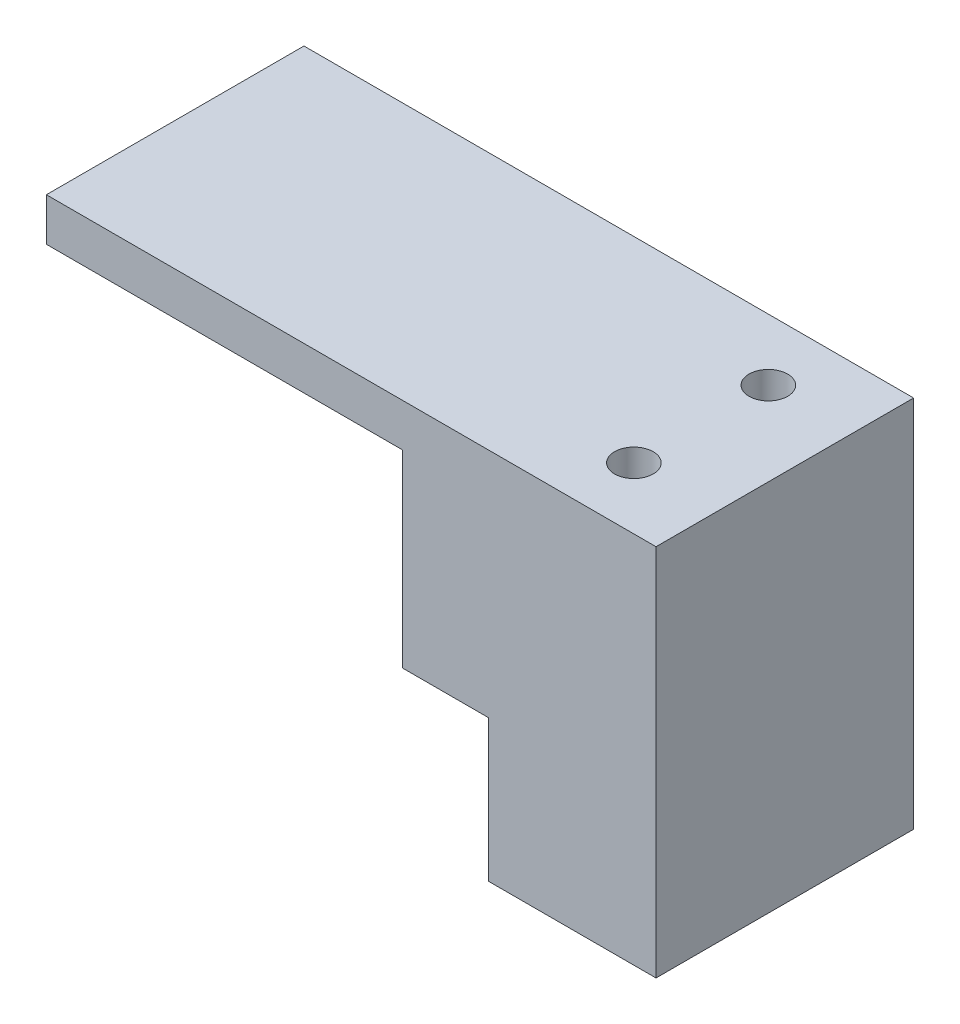
ISO-10303-21;
HEADER;
FILE_DESCRIPTION(('STEP AP214'),'2;1');
FILE_NAME('part.step','',(''),(''),'','','');
FILE_SCHEMA(('AUTOMOTIVE_DESIGN { 1 0 10303 214 1 1 1 1 }'));
ENDSEC;
DATA;
#1=APPLICATION_CONTEXT('core data for automotive mechanical design processes');
#2=APPLICATION_PROTOCOL_DEFINITION('international standard','automotive_design',2000,#1);
#3=PRODUCT_CONTEXT('',#1,'mechanical');
#4=PRODUCT('Part','Part','',(#3));
#5=PRODUCT_RELATED_PRODUCT_CATEGORY('part','',(#4));
#6=PRODUCT_DEFINITION_FORMATION('','',#4);
#7=PRODUCT_DEFINITION_CONTEXT('part definition',#1,'design');
#8=PRODUCT_DEFINITION('design','',#6,#7);
#9=PRODUCT_DEFINITION_SHAPE('','',#8);
#10=(LENGTH_UNIT() NAMED_UNIT(*) SI_UNIT(.MILLI.,.METRE.));
#11=(NAMED_UNIT(*) PLANE_ANGLE_UNIT() SI_UNIT($,.RADIAN.));
#12=(NAMED_UNIT(*) SI_UNIT($,.STERADIAN.) SOLID_ANGLE_UNIT());
#13=UNCERTAINTY_MEASURE_WITH_UNIT(LENGTH_MEASURE(1.E-05),#10,'distance_accuracy_value','');
#14=(GEOMETRIC_REPRESENTATION_CONTEXT(3) GLOBAL_UNCERTAINTY_ASSIGNED_CONTEXT((#13)) GLOBAL_UNIT_ASSIGNED_CONTEXT((#10,
#11,#12)) REPRESENTATION_CONTEXT('',''));
#15=CARTESIAN_POINT('',(0.,0.,0.));
#16=DIRECTION('',(0.,0.,1.));
#17=DIRECTION('',(1.,0.,0.));
#18=AXIS2_PLACEMENT_3D('',#15,#16,#17);
#19=CARTESIAN_POINT('',(0.,0.,0.));
#20=DIRECTION('',(0.,-1.,0.));
#21=DIRECTION('',(0.,0.,-1.));
#22=AXIS2_PLACEMENT_3D('',#19,#20,#21);
#23=PLANE('',#22);
#24=CARTESIAN_POINT('',(9.75,0.,-22.8300926632119));
#25=DIRECTION('',(0.,1.,0.));
#26=DIRECTION('',(0.,0.,1.));
#27=AXIS2_PLACEMENT_3D('',#24,#25,#26);
#28=CIRCLE('',#27,2.25);
#29=CARTESIAN_POINT('',(9.75,0.,-20.5800926632119));
#30=VERTEX_POINT('',#29);
#31=EDGE_CURVE('E127',#30,#30,#28,.T.);
#32=ORIENTED_EDGE('',*,*,#31,.T.);
#33=EDGE_LOOP('',(#32));
#34=FACE_BOUND('',#33,.T.);
#35=DIRECTION('',(0.,0.,1.));
#36=VECTOR('',#35,1.);
#37=CARTESIAN_POINT('',(0.,0.,0.));
#38=LINE('',#37,#36);
#39=CARTESIAN_POINT('',(0.,0.,-30.));
#40=VERTEX_POINT('',#39);
#41=CARTESIAN_POINT('',(0.,0.,0.));
#42=VERTEX_POINT('',#41);
#43=EDGE_CURVE('E87',#40,#42,#38,.T.);
#44=ORIENTED_EDGE('',*,*,#43,.F.);
#45=DIRECTION('',(-1.,0.,0.));
#46=VECTOR('',#45,1.);
#47=CARTESIAN_POINT('',(0.,0.,-30.));
#48=LINE('',#47,#46);
#49=CARTESIAN_POINT('',(19.5,0.,-30.));
#50=VERTEX_POINT('',#49);
#51=EDGE_CURVE('E75',#50,#40,#48,.T.);
#52=ORIENTED_EDGE('',*,*,#51,.F.);
#53=DIRECTION('',(0.,0.,-1.));
#54=VECTOR('',#53,1.);
#55=CARTESIAN_POINT('',(19.5,0.,0.));
#56=LINE('',#55,#54);
#57=CARTESIAN_POINT('',(19.5,0.,0.));
#58=VERTEX_POINT('',#57);
#59=EDGE_CURVE('E65',#58,#50,#56,.T.);
#60=ORIENTED_EDGE('',*,*,#59,.F.);
#61=DIRECTION('',(1.,0.,0.));
#62=VECTOR('',#61,1.);
#63=CARTESIAN_POINT('',(0.,0.,0.));
#64=LINE('',#63,#62);
#65=EDGE_CURVE('E76',#42,#58,#64,.T.);
#66=ORIENTED_EDGE('',*,*,#65,.F.);
#67=EDGE_LOOP('',(#44,#52,#60,#66));
#68=FACE_BOUND('',#67,.T.);
#69=CARTESIAN_POINT('',(9.75,0.,-7.16990733678813));
#70=DIRECTION('',(0.,1.,0.));
#71=DIRECTION('',(0.,0.,1.));
#72=AXIS2_PLACEMENT_3D('',#69,#70,#71);
#73=CIRCLE('',#72,2.25);
#74=CARTESIAN_POINT('',(9.75,0.,-4.91990733678813));
#75=VERTEX_POINT('',#74);
#76=EDGE_CURVE('E124',#75,#75,#73,.T.);
#77=ORIENTED_EDGE('',*,*,#76,.T.);
#78=EDGE_LOOP('',(#77));
#79=FACE_BOUND('',#78,.T.);
#80=ADVANCED_FACE('F32',(#34,#68,#79),#23,.T.);
#81=CARTESIAN_POINT('',(0.,16.5,0.));
#82=DIRECTION('',(1.,0.,0.));
#83=DIRECTION('',(0.,0.,-1.));
#84=AXIS2_PLACEMENT_3D('',#81,#82,#83);
#85=PLANE('',#84);
#86=ORIENTED_EDGE('',*,*,#43,.T.);
#87=DIRECTION('',(0.,-1.,0.));
#88=VECTOR('',#87,1.);
#89=CARTESIAN_POINT('',(0.,16.5,0.));
#90=LINE('',#89,#88);
#91=CARTESIAN_POINT('',(0.,16.5,0.));
#92=VERTEX_POINT('',#91);
#93=EDGE_CURVE('E11',#92,#42,#90,.T.);
#94=ORIENTED_EDGE('',*,*,#93,.F.);
#95=DIRECTION('',(0.,0.,1.));
#96=VECTOR('',#95,1.);
#97=CARTESIAN_POINT('',(0.,16.5,0.));
#98=LINE('',#97,#96);
#99=CARTESIAN_POINT('',(0.,16.5,-30.));
#100=VERTEX_POINT('',#99);
#101=EDGE_CURVE('E88',#100,#92,#98,.T.);
#102=ORIENTED_EDGE('',*,*,#101,.F.);
#103=DIRECTION('',(0.,-1.,0.));
#104=VECTOR('',#103,1.);
#105=CARTESIAN_POINT('',(0.,16.5,-30.));
#106=LINE('',#105,#104);
#107=EDGE_CURVE('E48',#100,#40,#106,.T.);
#108=ORIENTED_EDGE('',*,*,#107,.T.);
#109=EDGE_LOOP('',(#86,#94,#102,#108));
#110=FACE_BOUND('',#109,.T.);
#111=ADVANCED_FACE('F34',(#110),#85,.F.);
#112=CARTESIAN_POINT('',(0.,16.5,0.));
#113=DIRECTION('',(0.,0.,-1.));
#114=DIRECTION('',(-1.,0.,0.));
#115=AXIS2_PLACEMENT_3D('',#112,#113,#114);
#116=PLANE('',#115);
#117=ORIENTED_EDGE('',*,*,#65,.T.);
#118=DIRECTION('',(0.,-1.,0.));
#119=VECTOR('',#118,1.);
#120=CARTESIAN_POINT('',(19.5,16.5,0.));
#121=LINE('',#120,#119);
#122=CARTESIAN_POINT('',(19.5,43.5,0.));
#123=VERTEX_POINT('',#122);
#124=EDGE_CURVE('E41',#123,#58,#121,.T.);
#125=ORIENTED_EDGE('',*,*,#124,.F.);
#126=DIRECTION('',(1.,0.,0.));
#127=VECTOR('',#126,1.);
#128=CARTESIAN_POINT('',(-51.5,43.5,0.));
#129=LINE('',#128,#127);
#130=CARTESIAN_POINT('',(-51.5,43.5,0.));
#131=VERTEX_POINT('',#130);
#132=EDGE_CURVE('E175',#131,#123,#129,.T.);
#133=ORIENTED_EDGE('',*,*,#132,.F.);
#134=DIRECTION('',(0.,-1.,0.));
#135=VECTOR('',#134,1.);
#136=CARTESIAN_POINT('',(-51.5,43.5,0.));
#137=LINE('',#136,#135);
#138=CARTESIAN_POINT('',(-51.5,38.5,0.));
#139=VERTEX_POINT('',#138);
#140=EDGE_CURVE('E113',#131,#139,#137,.T.);
#141=ORIENTED_EDGE('',*,*,#140,.T.);
#142=DIRECTION('',(1.,0.,0.));
#143=VECTOR('',#142,1.);
#144=CARTESIAN_POINT('',(-10.,38.5,0.));
#145=LINE('',#144,#143);
#146=CARTESIAN_POINT('',(-10.,38.5,0.));
#147=VERTEX_POINT('',#146);
#148=EDGE_CURVE('E184',#139,#147,#145,.T.);
#149=ORIENTED_EDGE('',*,*,#148,.T.);
#150=DIRECTION('',(0.,-1.,0.));
#151=VECTOR('',#150,1.);
#152=CARTESIAN_POINT('',(-10.,38.5,0.));
#153=LINE('',#152,#151);
#154=CARTESIAN_POINT('',(-10.,16.5,0.));
#155=VERTEX_POINT('',#154);
#156=EDGE_CURVE('E119',#147,#155,#153,.T.);
#157=ORIENTED_EDGE('',*,*,#156,.T.);
#158=DIRECTION('',(1.,0.,0.));
#159=VECTOR('',#158,1.);
#160=CARTESIAN_POINT('',(0.,16.5,0.));
#161=LINE('',#160,#159);
#162=EDGE_CURVE('E110',#155,#92,#161,.T.);
#163=ORIENTED_EDGE('',*,*,#162,.T.);
#164=ORIENTED_EDGE('',*,*,#93,.T.);
#165=EDGE_LOOP('',(#117,#125,#133,#141,#149,#157,#163,#164));
#166=FACE_BOUND('',#165,.T.);
#167=ADVANCED_FACE('F131',(#166),#116,.F.);
#168=CARTESIAN_POINT('',(19.5,16.5,0.));
#169=DIRECTION('',(-1.,0.,0.));
#170=DIRECTION('',(0.,0.,1.));
#171=AXIS2_PLACEMENT_3D('',#168,#169,#170);
#172=PLANE('',#171);
#173=ORIENTED_EDGE('',*,*,#59,.T.);
#174=DIRECTION('',(0.,-1.,0.));
#175=VECTOR('',#174,1.);
#176=CARTESIAN_POINT('',(19.5,16.5,-30.));
#177=LINE('',#176,#175);
#178=CARTESIAN_POINT('',(19.5,43.5,-30.));
#179=VERTEX_POINT('',#178);
#180=EDGE_CURVE('E70',#179,#50,#177,.T.);
#181=ORIENTED_EDGE('',*,*,#180,.F.);
#182=DIRECTION('',(0.,0.,-1.));
#183=VECTOR('',#182,1.);
#184=CARTESIAN_POINT('',(19.5,43.5,0.));
#185=LINE('',#184,#183);
#186=EDGE_CURVE('E168',#123,#179,#185,.T.);
#187=ORIENTED_EDGE('',*,*,#186,.F.);
#188=ORIENTED_EDGE('',*,*,#124,.T.);
#189=EDGE_LOOP('',(#173,#181,#187,#188));
#190=FACE_BOUND('',#189,.T.);
#191=ADVANCED_FACE('F67',(#190),#172,.F.);
#192=CARTESIAN_POINT('',(0.,16.5,-30.));
#193=DIRECTION('',(0.,0.,1.));
#194=DIRECTION('',(1.,0.,0.));
#195=AXIS2_PLACEMENT_3D('',#192,#193,#194);
#196=PLANE('',#195);
#197=ORIENTED_EDGE('',*,*,#51,.T.);
#198=ORIENTED_EDGE('',*,*,#107,.F.);
#199=DIRECTION('',(-1.,0.,0.));
#200=VECTOR('',#199,1.);
#201=CARTESIAN_POINT('',(0.,16.5,-30.));
#202=LINE('',#201,#200);
#203=CARTESIAN_POINT('',(-10.,16.5,-30.));
#204=VERTEX_POINT('',#203);
#205=EDGE_CURVE('E101',#100,#204,#202,.T.);
#206=ORIENTED_EDGE('',*,*,#205,.T.);
#207=DIRECTION('',(0.,-1.,0.));
#208=VECTOR('',#207,1.);
#209=CARTESIAN_POINT('',(-10.,38.5,-30.));
#210=LINE('',#209,#208);
#211=CARTESIAN_POINT('',(-10.,38.5,-30.));
#212=VERTEX_POINT('',#211);
#213=EDGE_CURVE('E122',#212,#204,#210,.T.);
#214=ORIENTED_EDGE('',*,*,#213,.F.);
#215=DIRECTION('',(-1.,0.,0.));
#216=VECTOR('',#215,1.);
#217=CARTESIAN_POINT('',(-10.,38.5,-30.));
#218=LINE('',#217,#216);
#219=CARTESIAN_POINT('',(-51.5,38.5,-30.));
#220=VERTEX_POINT('',#219);
#221=EDGE_CURVE('E148',#212,#220,#218,.T.);
#222=ORIENTED_EDGE('',*,*,#221,.T.);
#223=DIRECTION('',(0.,-1.,0.));
#224=VECTOR('',#223,1.);
#225=CARTESIAN_POINT('',(-51.5,43.5,-30.));
#226=LINE('',#225,#224);
#227=CARTESIAN_POINT('',(-51.5,43.5,-30.));
#228=VERTEX_POINT('',#227);
#229=EDGE_CURVE('E108',#228,#220,#226,.T.);
#230=ORIENTED_EDGE('',*,*,#229,.F.);
#231=DIRECTION('',(-1.,0.,0.));
#232=VECTOR('',#231,1.);
#233=CARTESIAN_POINT('',(19.5,43.5,-30.));
#234=LINE('',#233,#232);
#235=EDGE_CURVE('E81',#179,#228,#234,.T.);
#236=ORIENTED_EDGE('',*,*,#235,.F.);
#237=ORIENTED_EDGE('',*,*,#180,.T.);
#238=EDGE_LOOP('',(#197,#198,#206,#214,#222,#230,#236,#237));
#239=FACE_BOUND('',#238,.T.);
#240=ADVANCED_FACE('F78',(#239),#196,.F.);
#241=CARTESIAN_POINT('',(9.75,16.5,-22.8300926632119));
#242=DIRECTION('',(0.,-1.,0.));
#243=DIRECTION('',(0.,0.,-1.));
#244=AXIS2_PLACEMENT_3D('',#241,#242,#243);
#245=CYLINDRICAL_SURFACE('',#244,2.25);
#246=ORIENTED_EDGE('',*,*,#31,.F.);
#247=EDGE_LOOP('',(#246));
#248=FACE_BOUND('',#247,.T.);
#249=CARTESIAN_POINT('',(9.75,43.5,-22.8300926632119));
#250=DIRECTION('',(0.,1.,0.));
#251=DIRECTION('',(0.,0.,1.));
#252=AXIS2_PLACEMENT_3D('',#249,#250,#251);
#253=CIRCLE('',#252,2.25);
#254=CARTESIAN_POINT('',(9.75,43.5,-20.5800926632119));
#255=VERTEX_POINT('',#254);
#256=EDGE_CURVE('E182',#255,#255,#253,.T.);
#257=ORIENTED_EDGE('',*,*,#256,.T.);
#258=EDGE_LOOP('',(#257));
#259=FACE_BOUND('',#258,.T.);
#260=ADVANCED_FACE('F214',(#248,#259),#245,.F.);
#261=CARTESIAN_POINT('',(9.75,16.5,-7.16990733678813));
#262=DIRECTION('',(0.,-1.,0.));
#263=DIRECTION('',(0.,0.,-1.));
#264=AXIS2_PLACEMENT_3D('',#261,#262,#263);
#265=CYLINDRICAL_SURFACE('',#264,2.25);
#266=ORIENTED_EDGE('',*,*,#76,.F.);
#267=EDGE_LOOP('',(#266));
#268=FACE_BOUND('',#267,.T.);
#269=CARTESIAN_POINT('',(9.75,43.5,-7.16990733678813));
#270=DIRECTION('',(0.,1.,0.));
#271=DIRECTION('',(0.,0.,1.));
#272=AXIS2_PLACEMENT_3D('',#269,#270,#271);
#273=CIRCLE('',#272,2.25);
#274=CARTESIAN_POINT('',(9.75,43.5,-4.91990733678813));
#275=VERTEX_POINT('',#274);
#276=EDGE_CURVE('E189',#275,#275,#273,.T.);
#277=ORIENTED_EDGE('',*,*,#276,.T.);
#278=EDGE_LOOP('',(#277));
#279=FACE_BOUND('',#278,.T.);
#280=ADVANCED_FACE('F193',(#268,#279),#265,.F.);
#281=CARTESIAN_POINT('',(0.,16.5,0.));
#282=DIRECTION('',(0.,1.,0.));
#283=DIRECTION('',(0.,0.,1.));
#284=AXIS2_PLACEMENT_3D('',#281,#282,#283);
#285=PLANE('',#284);
#286=ORIENTED_EDGE('',*,*,#205,.F.);
#287=ORIENTED_EDGE('',*,*,#101,.T.);
#288=ORIENTED_EDGE('',*,*,#162,.F.);
#289=DIRECTION('',(0.,0.,1.));
#290=VECTOR('',#289,1.);
#291=CARTESIAN_POINT('',(-10.,16.5,-30.));
#292=LINE('',#291,#290);
#293=EDGE_CURVE('E105',#204,#155,#292,.T.);
#294=ORIENTED_EDGE('',*,*,#293,.F.);
#295=EDGE_LOOP('',(#286,#287,#288,#294));
#296=FACE_BOUND('',#295,.T.);
#297=ADVANCED_FACE('F102',(#296),#285,.F.);
#298=CARTESIAN_POINT('',(-10.,38.5,-30.));
#299=DIRECTION('',(1.,0.,0.));
#300=DIRECTION('',(0.,0.,-1.));
#301=AXIS2_PLACEMENT_3D('',#298,#299,#300);
#302=PLANE('',#301);
#303=ORIENTED_EDGE('',*,*,#293,.T.);
#304=ORIENTED_EDGE('',*,*,#156,.F.);
#305=DIRECTION('',(0.,0.,1.));
#306=VECTOR('',#305,1.);
#307=CARTESIAN_POINT('',(-10.,38.5,-30.));
#308=LINE('',#307,#306);
#309=EDGE_CURVE('E116',#212,#147,#308,.T.);
#310=ORIENTED_EDGE('',*,*,#309,.F.);
#311=ORIENTED_EDGE('',*,*,#213,.T.);
#312=EDGE_LOOP('',(#303,#304,#310,#311));
#313=FACE_BOUND('',#312,.T.);
#314=ADVANCED_FACE('F140',(#313),#302,.F.);
#315=CARTESIAN_POINT('',(0.,38.5,0.));
#316=DIRECTION('',(0.,1.,0.));
#317=DIRECTION('',(0.,0.,1.));
#318=AXIS2_PLACEMENT_3D('',#315,#316,#317);
#319=PLANE('',#318);
#320=ORIENTED_EDGE('',*,*,#221,.F.);
#321=ORIENTED_EDGE('',*,*,#309,.T.);
#322=ORIENTED_EDGE('',*,*,#148,.F.);
#323=DIRECTION('',(0.,0.,1.));
#324=VECTOR('',#323,1.);
#325=CARTESIAN_POINT('',(-51.5,38.5,-30.));
#326=LINE('',#325,#324);
#327=EDGE_CURVE('E181',#220,#139,#326,.T.);
#328=ORIENTED_EDGE('',*,*,#327,.F.);
#329=EDGE_LOOP('',(#320,#321,#322,#328));
#330=FACE_BOUND('',#329,.T.);
#331=ADVANCED_FACE('F195',(#330),#319,.F.);
#332=CARTESIAN_POINT('',(0.,43.5,0.));
#333=DIRECTION('',(0.,1.,0.));
#334=DIRECTION('',(0.,0.,1.));
#335=AXIS2_PLACEMENT_3D('',#332,#333,#334);
#336=PLANE('',#335);
#337=ORIENTED_EDGE('',*,*,#256,.F.);
#338=EDGE_LOOP('',(#337));
#339=FACE_BOUND('',#338,.T.);
#340=ORIENTED_EDGE('',*,*,#186,.T.);
#341=ORIENTED_EDGE('',*,*,#235,.T.);
#342=DIRECTION('',(0.,0.,1.));
#343=VECTOR('',#342,1.);
#344=CARTESIAN_POINT('',(-51.5,43.5,-30.));
#345=LINE('',#344,#343);
#346=EDGE_CURVE('E166',#228,#131,#345,.T.);
#347=ORIENTED_EDGE('',*,*,#346,.T.);
#348=ORIENTED_EDGE('',*,*,#132,.T.);
#349=EDGE_LOOP('',(#340,#341,#347,#348));
#350=FACE_BOUND('',#349,.T.);
#351=ORIENTED_EDGE('',*,*,#276,.F.);
#352=EDGE_LOOP('',(#351));
#353=FACE_BOUND('',#352,.T.);
#354=ADVANCED_FACE('F163',(#339,#350,#353),#336,.T.);
#355=CARTESIAN_POINT('',(-51.5,43.5,-30.));
#356=DIRECTION('',(1.,0.,0.));
#357=DIRECTION('',(0.,0.,-1.));
#358=AXIS2_PLACEMENT_3D('',#355,#356,#357);
#359=PLANE('',#358);
#360=ORIENTED_EDGE('',*,*,#327,.T.);
#361=ORIENTED_EDGE('',*,*,#140,.F.);
#362=ORIENTED_EDGE('',*,*,#346,.F.);
#363=ORIENTED_EDGE('',*,*,#229,.T.);
#364=EDGE_LOOP('',(#360,#361,#362,#363));
#365=FACE_BOUND('',#364,.T.);
#366=ADVANCED_FACE('F173',(#365),#359,.F.);
#367=CLOSED_SHELL('',(#80,#111,#167,#191,#240,#260,#280,#297,#314,#331,#354,#366));
#368=MANIFOLD_SOLID_BREP('B2',#367);
#369=ADVANCED_BREP_SHAPE_REPRESENTATION('',(#18,#368),#14);
#370=SHAPE_DEFINITION_REPRESENTATION(#9,#369);
ENDSEC;
END-ISO-10303-21;
